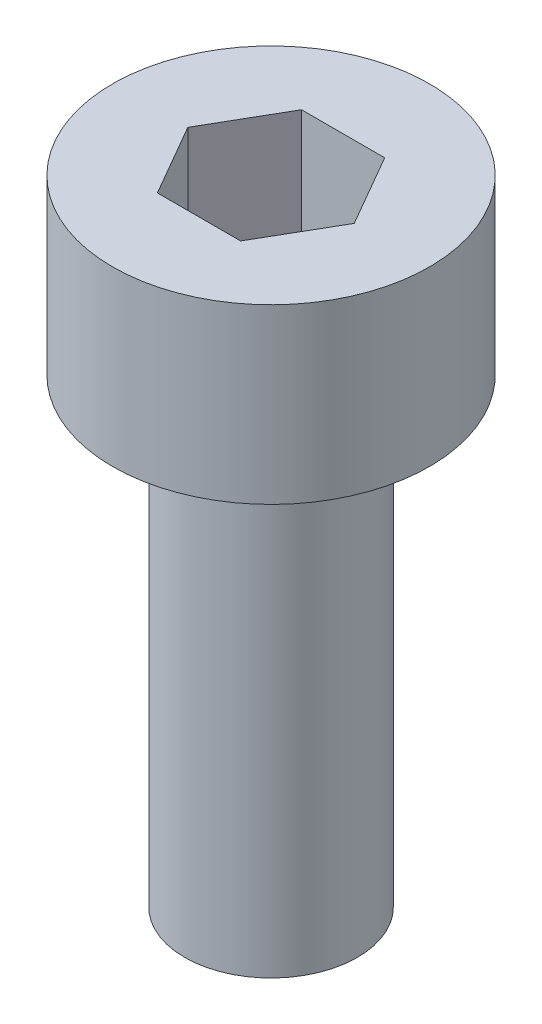
ISO-10303-21;
HEADER;
FILE_DESCRIPTION(('STEP AP214'),'2;1');
FILE_NAME('part.step','',(''),(''),'','','');
FILE_SCHEMA(('AUTOMOTIVE_DESIGN { 1 0 10303 214 1 1 1 1 }'));
ENDSEC;
DATA;
#1=APPLICATION_CONTEXT('core data for automotive mechanical design processes');
#2=APPLICATION_PROTOCOL_DEFINITION('international standard','automotive_design',2000,#1);
#3=PRODUCT_CONTEXT('',#1,'mechanical');
#4=PRODUCT('Part','Part','',(#3));
#5=PRODUCT_RELATED_PRODUCT_CATEGORY('part','',(#4));
#6=PRODUCT_DEFINITION_FORMATION('','',#4);
#7=PRODUCT_DEFINITION_CONTEXT('part definition',#1,'design');
#8=PRODUCT_DEFINITION('design','',#6,#7);
#9=PRODUCT_DEFINITION_SHAPE('','',#8);
#10=(LENGTH_UNIT() NAMED_UNIT(*) SI_UNIT(.MILLI.,.METRE.));
#11=(NAMED_UNIT(*) PLANE_ANGLE_UNIT() SI_UNIT($,.RADIAN.));
#12=(NAMED_UNIT(*) SI_UNIT($,.STERADIAN.) SOLID_ANGLE_UNIT());
#13=UNCERTAINTY_MEASURE_WITH_UNIT(LENGTH_MEASURE(1.E-05),#10,'distance_accuracy_value','');
#14=(GEOMETRIC_REPRESENTATION_CONTEXT(3) GLOBAL_UNCERTAINTY_ASSIGNED_CONTEXT((#13)) GLOBAL_UNIT_ASSIGNED_CONTEXT((#10,
#11,#12)) REPRESENTATION_CONTEXT('',''));
#15=CARTESIAN_POINT('',(0.,0.,0.));
#16=DIRECTION('',(0.,0.,1.));
#17=DIRECTION('',(1.,0.,0.));
#18=AXIS2_PLACEMENT_3D('',#15,#16,#17);
#19=CARTESIAN_POINT('',(2.75000000000001,3.,0.));
#20=DIRECTION('',(0.,-1.,0.));
#21=DIRECTION('',(0.,0.,-1.));
#22=AXIS2_PLACEMENT_3D('',#19,#20,#21);
#23=PLANE('',#22);
#24=DIRECTION('',(-1.,0.,0.));
#25=VECTOR('',#24,1.);
#26=CARTESIAN_POINT('',(0.721687836487033,3.,-1.25));
#27=LINE('',#26,#25);
#28=CARTESIAN_POINT('',(0.721687836487033,3.,-1.25));
#29=VERTEX_POINT('',#28);
#30=CARTESIAN_POINT('',(-0.721687836487032,3.,-1.25));
#31=VERTEX_POINT('',#30);
#32=EDGE_CURVE('E121',#29,#31,#27,.T.);
#33=ORIENTED_EDGE('',*,*,#32,.F.);
#34=DIRECTION('',(-0.5,0.,-0.866025403784439));
#35=VECTOR('',#34,1.);
#36=CARTESIAN_POINT('',(1.44337567297407,3.,0.));
#37=LINE('',#36,#35);
#38=CARTESIAN_POINT('',(1.44337567297407,3.,0.));
#39=VERTEX_POINT('',#38);
#40=EDGE_CURVE('E47',#39,#29,#37,.T.);
#41=ORIENTED_EDGE('',*,*,#40,.F.);
#42=DIRECTION('',(0.5,0.,-0.866025403784439));
#43=VECTOR('',#42,1.);
#44=CARTESIAN_POINT('',(0.721687836487033,3.,1.25));
#45=LINE('',#44,#43);
#46=CARTESIAN_POINT('',(0.721687836487033,3.,1.25));
#47=VERTEX_POINT('',#46);
#48=EDGE_CURVE('E130',#47,#39,#45,.T.);
#49=ORIENTED_EDGE('',*,*,#48,.F.);
#50=DIRECTION('',(1.,0.,0.));
#51=VECTOR('',#50,1.);
#52=CARTESIAN_POINT('',(-0.721687836487031,3.,1.25));
#53=LINE('',#52,#51);
#54=CARTESIAN_POINT('',(-0.721687836487031,3.,1.25));
#55=VERTEX_POINT('',#54);
#56=EDGE_CURVE('E128',#55,#47,#53,.T.);
#57=ORIENTED_EDGE('',*,*,#56,.F.);
#58=DIRECTION('',(0.5,0.,0.866025403784439));
#59=VECTOR('',#58,1.);
#60=CARTESIAN_POINT('',(-1.44337567297406,3.,0.));
#61=LINE('',#60,#59);
#62=CARTESIAN_POINT('',(-1.44337567297406,3.,0.));
#63=VERTEX_POINT('',#62);
#64=EDGE_CURVE('E95',#63,#55,#61,.T.);
#65=ORIENTED_EDGE('',*,*,#64,.F.);
#66=DIRECTION('',(-0.5,0.,0.866025403784439));
#67=VECTOR('',#66,1.);
#68=CARTESIAN_POINT('',(-0.721687836487032,3.,-1.25));
#69=LINE('',#68,#67);
#70=EDGE_CURVE('E124',#31,#63,#69,.T.);
#71=ORIENTED_EDGE('',*,*,#70,.F.);
#72=EDGE_LOOP('',(#33,#41,#49,#57,#65,#71));
#73=FACE_BOUND('',#72,.T.);
#74=CARTESIAN_POINT('',(0.,3.,0.));
#75=DIRECTION('',(0.,1.,0.));
#76=DIRECTION('',(0.,0.,1.));
#77=AXIS2_PLACEMENT_3D('',#74,#75,#76);
#78=CIRCLE('',#77,2.75000000000001);
#79=CARTESIAN_POINT('',(0.,3.,2.75000000000001));
#80=VERTEX_POINT('',#79);
#81=EDGE_CURVE('E11',#80,#80,#78,.T.);
#82=ORIENTED_EDGE('',*,*,#81,.T.);
#83=EDGE_LOOP('',(#82));
#84=FACE_BOUND('',#83,.T.);
#85=ADVANCED_FACE('F33',(#73,#84),#23,.F.);
#86=CARTESIAN_POINT('',(0.,61.6916426261037,0.));
#87=DIRECTION('',(0.,1.,0.));
#88=DIRECTION('',(0.,0.,1.));
#89=AXIS2_PLACEMENT_3D('',#86,#87,#88);
#90=CYLINDRICAL_SURFACE('',#89,2.75000000000001);
#91=ORIENTED_EDGE('',*,*,#81,.F.);
#92=EDGE_LOOP('',(#91));
#93=FACE_BOUND('',#92,.T.);
#94=CARTESIAN_POINT('',(0.,0.,0.));
#95=DIRECTION('',(0.,1.,0.));
#96=DIRECTION('',(0.,0.,1.));
#97=AXIS2_PLACEMENT_3D('',#94,#95,#96);
#98=CIRCLE('',#97,2.75000000000001);
#99=CARTESIAN_POINT('',(0.,0.,2.75000000000001));
#100=VERTEX_POINT('',#99);
#101=EDGE_CURVE('E40',#100,#100,#98,.T.);
#102=ORIENTED_EDGE('',*,*,#101,.T.);
#103=EDGE_LOOP('',(#102));
#104=FACE_BOUND('',#103,.T.);
#105=ADVANCED_FACE('F147',(#93,#104),#90,.T.);
#106=CARTESIAN_POINT('',(1.50000000000001,0.,0.));
#107=DIRECTION('',(0.,1.,0.));
#108=DIRECTION('',(0.,0.,1.));
#109=AXIS2_PLACEMENT_3D('',#106,#107,#108);
#110=PLANE('',#109);
#111=ORIENTED_EDGE('',*,*,#101,.F.);
#112=EDGE_LOOP('',(#111));
#113=FACE_BOUND('',#112,.T.);
#114=CARTESIAN_POINT('',(0.,0.,0.));
#115=DIRECTION('',(0.,1.,0.));
#116=DIRECTION('',(0.,0.,1.));
#117=AXIS2_PLACEMENT_3D('',#114,#115,#116);
#118=CIRCLE('',#117,1.50000000000001);
#119=CARTESIAN_POINT('',(0.,0.,1.50000000000001));
#120=VERTEX_POINT('',#119);
#121=EDGE_CURVE('E142',#120,#120,#118,.T.);
#122=ORIENTED_EDGE('',*,*,#121,.T.);
#123=EDGE_LOOP('',(#122));
#124=FACE_BOUND('',#123,.T.);
#125=ADVANCED_FACE('F149',(#113,#124),#110,.F.);
#126=CARTESIAN_POINT('',(0.,61.6916426261037,0.));
#127=DIRECTION('',(0.,1.,0.));
#128=DIRECTION('',(0.,0.,1.));
#129=AXIS2_PLACEMENT_3D('',#126,#127,#128);
#130=CYLINDRICAL_SURFACE('',#129,1.50000000000001);
#131=ORIENTED_EDGE('',*,*,#121,.F.);
#132=EDGE_LOOP('',(#131));
#133=FACE_BOUND('',#132,.T.);
#134=CARTESIAN_POINT('',(0.,-7.99999999999999,0.));
#135=DIRECTION('',(0.,1.,0.));
#136=DIRECTION('',(0.,0.,1.));
#137=AXIS2_PLACEMENT_3D('',#134,#135,#136);
#138=CIRCLE('',#137,1.50000000000001);
#139=CARTESIAN_POINT('',(0.,-7.99999999999999,1.50000000000001));
#140=VERTEX_POINT('',#139);
#141=EDGE_CURVE('E134',#140,#140,#138,.T.);
#142=ORIENTED_EDGE('',*,*,#141,.T.);
#143=EDGE_LOOP('',(#142));
#144=FACE_BOUND('',#143,.T.);
#145=ADVANCED_FACE('F152',(#133,#144),#130,.T.);
#146=CARTESIAN_POINT('',(0.,-8.,0.));
#147=DIRECTION('',(0.,1.,0.));
#148=DIRECTION('',(0.,0.,1.));
#149=AXIS2_PLACEMENT_3D('',#146,#147,#148);
#150=PLANE('',#149);
#151=ORIENTED_EDGE('',*,*,#141,.F.);
#152=EDGE_LOOP('',(#151));
#153=FACE_BOUND('',#152,.T.);
#154=ADVANCED_FACE('F158',(#153),#150,.F.);
#155=CARTESIAN_POINT('',(1.44337567297407,0.499999999999999,0.));
#156=DIRECTION('',(0.866025403784439,0.,-0.5));
#157=DIRECTION('',(-0.5,0.,-0.866025403784439));
#158=AXIS2_PLACEMENT_3D('',#155,#156,#157);
#159=PLANE('',#158);
#160=ORIENTED_EDGE('',*,*,#40,.T.);
#161=DIRECTION('',(0.,1.,0.));
#162=VECTOR('',#161,1.);
#163=CARTESIAN_POINT('',(0.721687836487033,0.499999999999999,-1.25));
#164=LINE('',#163,#162);
#165=CARTESIAN_POINT('',(0.721687836487033,0.499999999999999,-1.25));
#166=VERTEX_POINT('',#165);
#167=EDGE_CURVE('E77',#166,#29,#164,.T.);
#168=ORIENTED_EDGE('',*,*,#167,.F.);
#169=DIRECTION('',(-0.5,0.,-0.866025403784439));
#170=VECTOR('',#169,1.);
#171=CARTESIAN_POINT('',(1.44337567297407,0.499999999999999,0.));
#172=LINE('',#171,#170);
#173=CARTESIAN_POINT('',(1.44337567297407,0.499999999999999,0.));
#174=VERTEX_POINT('',#173);
#175=EDGE_CURVE('E132',#174,#166,#172,.T.);
#176=ORIENTED_EDGE('',*,*,#175,.F.);
#177=DIRECTION('',(0.,1.,0.));
#178=VECTOR('',#177,1.);
#179=CARTESIAN_POINT('',(1.44337567297407,0.499999999999999,0.));
#180=LINE('',#179,#178);
#181=EDGE_CURVE('E55',#174,#39,#180,.T.);
#182=ORIENTED_EDGE('',*,*,#181,.T.);
#183=EDGE_LOOP('',(#160,#168,#176,#182));
#184=FACE_BOUND('',#183,.T.);
#185=ADVANCED_FACE('F163',(#184),#159,.F.);
#186=CARTESIAN_POINT('',(0.721687836487033,0.499999999999999,1.25));
#187=DIRECTION('',(0.866025403784439,0.,0.5));
#188=DIRECTION('',(0.5,0.,-0.866025403784439));
#189=AXIS2_PLACEMENT_3D('',#186,#187,#188);
#190=PLANE('',#189);
#191=ORIENTED_EDGE('',*,*,#48,.T.);
#192=ORIENTED_EDGE('',*,*,#181,.F.);
#193=DIRECTION('',(0.5,0.,-0.866025403784439));
#194=VECTOR('',#193,1.);
#195=CARTESIAN_POINT('',(0.721687836487033,0.499999999999999,1.25));
#196=LINE('',#195,#194);
#197=CARTESIAN_POINT('',(0.721687836487033,0.499999999999999,1.25));
#198=VERTEX_POINT('',#197);
#199=EDGE_CURVE('E107',#198,#174,#196,.T.);
#200=ORIENTED_EDGE('',*,*,#199,.F.);
#201=DIRECTION('',(0.,1.,0.));
#202=VECTOR('',#201,1.);
#203=CARTESIAN_POINT('',(0.721687836487033,0.499999999999999,1.25));
#204=LINE('',#203,#202);
#205=EDGE_CURVE('E99',#198,#47,#204,.T.);
#206=ORIENTED_EDGE('',*,*,#205,.T.);
#207=EDGE_LOOP('',(#191,#192,#200,#206));
#208=FACE_BOUND('',#207,.T.);
#209=ADVANCED_FACE('F168',(#208),#190,.F.);
#210=CARTESIAN_POINT('',(-0.721687836487031,0.499999999999999,1.25));
#211=DIRECTION('',(0.,0.,1.));
#212=DIRECTION('',(1.,0.,0.));
#213=AXIS2_PLACEMENT_3D('',#210,#211,#212);
#214=PLANE('',#213);
#215=ORIENTED_EDGE('',*,*,#56,.T.);
#216=ORIENTED_EDGE('',*,*,#205,.F.);
#217=DIRECTION('',(1.,0.,0.));
#218=VECTOR('',#217,1.);
#219=CARTESIAN_POINT('',(-0.721687836487031,0.499999999999999,1.25));
#220=LINE('',#219,#218);
#221=CARTESIAN_POINT('',(-0.721687836487031,0.499999999999999,1.25));
#222=VERTEX_POINT('',#221);
#223=EDGE_CURVE('E103',#222,#198,#220,.T.);
#224=ORIENTED_EDGE('',*,*,#223,.F.);
#225=DIRECTION('',(0.,1.,0.));
#226=VECTOR('',#225,1.);
#227=CARTESIAN_POINT('',(-0.721687836487031,0.499999999999999,1.25));
#228=LINE('',#227,#226);
#229=EDGE_CURVE('E88',#222,#55,#228,.T.);
#230=ORIENTED_EDGE('',*,*,#229,.T.);
#231=EDGE_LOOP('',(#215,#216,#224,#230));
#232=FACE_BOUND('',#231,.T.);
#233=ADVANCED_FACE('F104',(#232),#214,.F.);
#234=CARTESIAN_POINT('',(-1.44337567297406,0.499999999999999,0.));
#235=DIRECTION('',(-0.866025403784438,0.,0.5));
#236=DIRECTION('',(0.5,0.,0.866025403784439));
#237=AXIS2_PLACEMENT_3D('',#234,#235,#236);
#238=PLANE('',#237);
#239=ORIENTED_EDGE('',*,*,#64,.T.);
#240=ORIENTED_EDGE('',*,*,#229,.F.);
#241=DIRECTION('',(0.5,0.,0.866025403784439));
#242=VECTOR('',#241,1.);
#243=CARTESIAN_POINT('',(-1.44337567297406,0.499999999999999,0.));
#244=LINE('',#243,#242);
#245=CARTESIAN_POINT('',(-1.44337567297406,0.499999999999999,0.));
#246=VERTEX_POINT('',#245);
#247=EDGE_CURVE('E92',#246,#222,#244,.T.);
#248=ORIENTED_EDGE('',*,*,#247,.F.);
#249=DIRECTION('',(0.,1.,0.));
#250=VECTOR('',#249,1.);
#251=CARTESIAN_POINT('',(-1.44337567297406,0.499999999999999,0.));
#252=LINE('',#251,#250);
#253=EDGE_CURVE('E100',#246,#63,#252,.T.);
#254=ORIENTED_EDGE('',*,*,#253,.T.);
#255=EDGE_LOOP('',(#239,#240,#248,#254));
#256=FACE_BOUND('',#255,.T.);
#257=ADVANCED_FACE('F90',(#256),#238,.F.);
#258=CARTESIAN_POINT('',(-0.721687836487032,0.499999999999999,-1.25));
#259=DIRECTION('',(-0.866025403784439,0.,-0.5));
#260=DIRECTION('',(-0.5,0.,0.866025403784439));
#261=AXIS2_PLACEMENT_3D('',#258,#259,#260);
#262=PLANE('',#261);
#263=ORIENTED_EDGE('',*,*,#70,.T.);
#264=ORIENTED_EDGE('',*,*,#253,.F.);
#265=DIRECTION('',(-0.5,0.,0.866025403784439));
#266=VECTOR('',#265,1.);
#267=CARTESIAN_POINT('',(-0.721687836487032,0.499999999999999,-1.25));
#268=LINE('',#267,#266);
#269=CARTESIAN_POINT('',(-0.721687836487032,0.499999999999999,-1.25));
#270=VERTEX_POINT('',#269);
#271=EDGE_CURVE('E113',#270,#246,#268,.T.);
#272=ORIENTED_EDGE('',*,*,#271,.F.);
#273=DIRECTION('',(0.,1.,0.));
#274=VECTOR('',#273,1.);
#275=CARTESIAN_POINT('',(-0.721687836487032,0.499999999999999,-1.25));
#276=LINE('',#275,#274);
#277=EDGE_CURVE('E137',#270,#31,#276,.T.);
#278=ORIENTED_EDGE('',*,*,#277,.T.);
#279=EDGE_LOOP('',(#263,#264,#272,#278));
#280=FACE_BOUND('',#279,.T.);
#281=ADVANCED_FACE('F194',(#280),#262,.F.);
#282=CARTESIAN_POINT('',(0.721687836487033,0.499999999999999,-1.25));
#283=DIRECTION('',(0.,0.,-1.));
#284=DIRECTION('',(-1.,0.,0.));
#285=AXIS2_PLACEMENT_3D('',#282,#283,#284);
#286=PLANE('',#285);
#287=ORIENTED_EDGE('',*,*,#32,.T.);
#288=ORIENTED_EDGE('',*,*,#277,.F.);
#289=DIRECTION('',(-1.,0.,0.));
#290=VECTOR('',#289,1.);
#291=CARTESIAN_POINT('',(0.721687836487033,0.499999999999999,-1.25));
#292=LINE('',#291,#290);
#293=EDGE_CURVE('E115',#166,#270,#292,.T.);
#294=ORIENTED_EDGE('',*,*,#293,.F.);
#295=ORIENTED_EDGE('',*,*,#167,.T.);
#296=EDGE_LOOP('',(#287,#288,#294,#295));
#297=FACE_BOUND('',#296,.T.);
#298=ADVANCED_FACE('F182',(#297),#286,.F.);
#299=CARTESIAN_POINT('',(0.721687836487033,0.499999999999999,-1.25));
#300=DIRECTION('',(0.,1.,0.));
#301=DIRECTION('',(0.,0.,1.));
#302=AXIS2_PLACEMENT_3D('',#299,#300,#301);
#303=PLANE('',#302);
#304=ORIENTED_EDGE('',*,*,#175,.T.);
#305=ORIENTED_EDGE('',*,*,#293,.T.);
#306=ORIENTED_EDGE('',*,*,#271,.T.);
#307=ORIENTED_EDGE('',*,*,#247,.T.);
#308=ORIENTED_EDGE('',*,*,#223,.T.);
#309=ORIENTED_EDGE('',*,*,#199,.T.);
#310=EDGE_LOOP('',(#304,#305,#306,#307,#308,#309));
#311=FACE_BOUND('',#310,.T.);
#312=ADVANCED_FACE('F110',(#311),#303,.T.);
#313=CLOSED_SHELL('',(#85,#105,#125,#145,#154,#185,#209,#233,#257,#281,#298,#312));
#314=MANIFOLD_SOLID_BREP('B2',#313);
#315=ADVANCED_BREP_SHAPE_REPRESENTATION('',(#18,#314),#14);
#316=SHAPE_DEFINITION_REPRESENTATION(#9,#315);
ENDSEC;
END-ISO-10303-21;
